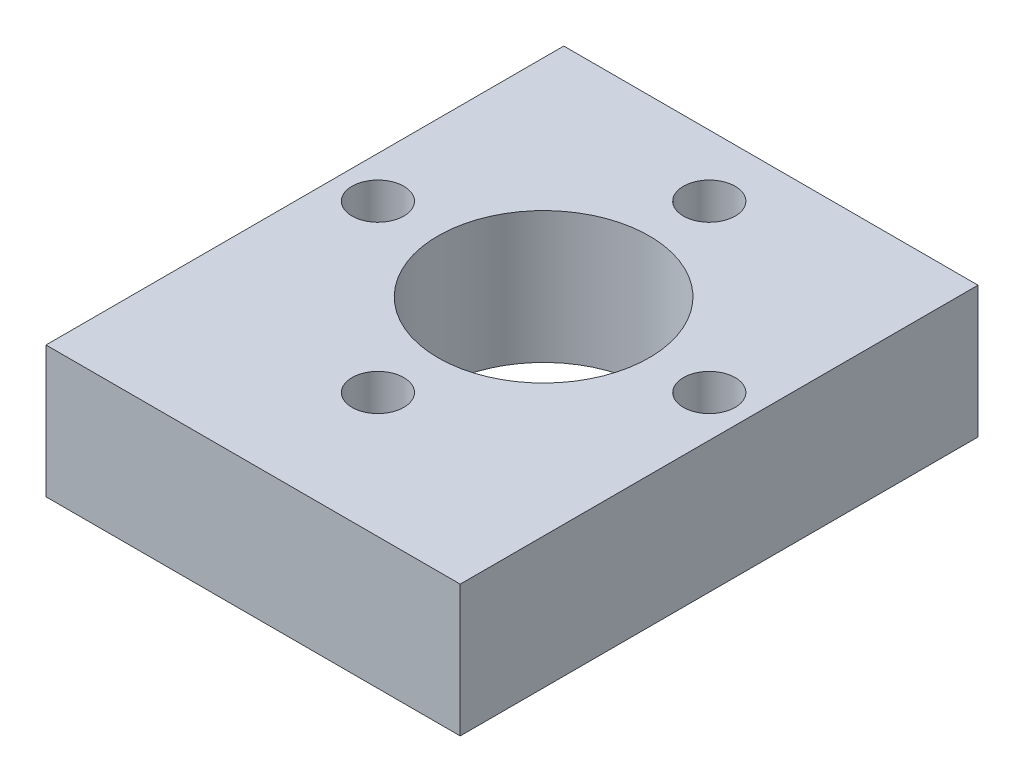
ISO-10303-21;
HEADER;
FILE_DESCRIPTION(('STEP AP214'),'2;1');
FILE_NAME('part.step','',(''),(''),'','','');
FILE_SCHEMA(('AUTOMOTIVE_DESIGN { 1 0 10303 214 1 1 1 1 }'));
ENDSEC;
DATA;
#1=APPLICATION_CONTEXT('core data for automotive mechanical design processes');
#2=APPLICATION_PROTOCOL_DEFINITION('international standard','automotive_design',2000,#1);
#3=PRODUCT_CONTEXT('',#1,'mechanical');
#4=PRODUCT('Part','Part','',(#3));
#5=PRODUCT_RELATED_PRODUCT_CATEGORY('part','',(#4));
#6=PRODUCT_DEFINITION_FORMATION('','',#4);
#7=PRODUCT_DEFINITION_CONTEXT('part definition',#1,'design');
#8=PRODUCT_DEFINITION('design','',#6,#7);
#9=PRODUCT_DEFINITION_SHAPE('','',#8);
#10=(LENGTH_UNIT() NAMED_UNIT(*) SI_UNIT(.MILLI.,.METRE.));
#11=(NAMED_UNIT(*) PLANE_ANGLE_UNIT() SI_UNIT($,.RADIAN.));
#12=(NAMED_UNIT(*) SI_UNIT($,.STERADIAN.) SOLID_ANGLE_UNIT());
#13=UNCERTAINTY_MEASURE_WITH_UNIT(LENGTH_MEASURE(1.E-05),#10,'distance_accuracy_value','');
#14=(GEOMETRIC_REPRESENTATION_CONTEXT(3) GLOBAL_UNCERTAINTY_ASSIGNED_CONTEXT((#13)) GLOBAL_UNIT_ASSIGNED_CONTEXT((#10,
#11,#12)) REPRESENTATION_CONTEXT('',''));
#15=CARTESIAN_POINT('',(0.,0.,0.));
#16=DIRECTION('',(0.,0.,1.));
#17=DIRECTION('',(1.,0.,0.));
#18=AXIS2_PLACEMENT_3D('',#15,#16,#17);
#19=CARTESIAN_POINT('',(0.,6.35,12.5));
#20=DIRECTION('',(0.,0.,-1.));
#21=DIRECTION('',(-1.,0.,0.));
#22=AXIS2_PLACEMENT_3D('',#19,#20,#21);
#23=PLANE('',#22);
#24=DIRECTION('',(1.,0.,0.));
#25=VECTOR('',#24,1.);
#26=CARTESIAN_POINT('',(0.,0.,12.5));
#27=LINE('',#26,#25);
#28=CARTESIAN_POINT('',(-10.,0.,12.5));
#29=VERTEX_POINT('',#28);
#30=CARTESIAN_POINT('',(10.,0.,12.5));
#31=VERTEX_POINT('',#30);
#32=EDGE_CURVE('E177',#29,#31,#27,.T.);
#33=ORIENTED_EDGE('',*,*,#32,.T.);
#34=DIRECTION('',(0.,-1.,0.));
#35=VECTOR('',#34,1.);
#36=CARTESIAN_POINT('',(10.,6.35,12.5));
#37=LINE('',#36,#35);
#38=CARTESIAN_POINT('',(10.,6.35,12.5));
#39=VERTEX_POINT('',#38);
#40=EDGE_CURVE('E11',#39,#31,#37,.T.);
#41=ORIENTED_EDGE('',*,*,#40,.F.);
#42=DIRECTION('',(1.,0.,0.));
#43=VECTOR('',#42,1.);
#44=CARTESIAN_POINT('',(0.,6.35,12.5));
#45=LINE('',#44,#43);
#46=CARTESIAN_POINT('',(-10.,6.35,12.5));
#47=VERTEX_POINT('',#46);
#48=EDGE_CURVE('E161',#47,#39,#45,.T.);
#49=ORIENTED_EDGE('',*,*,#48,.F.);
#50=DIRECTION('',(0.,-1.,0.));
#51=VECTOR('',#50,1.);
#52=CARTESIAN_POINT('',(-10.,6.35,12.5));
#53=LINE('',#52,#51);
#54=EDGE_CURVE('E65',#47,#29,#53,.T.);
#55=ORIENTED_EDGE('',*,*,#54,.T.);
#56=EDGE_LOOP('',(#33,#41,#49,#55));
#57=FACE_BOUND('',#56,.T.);
#58=ADVANCED_FACE('F47',(#57),#23,.F.);
#59=CARTESIAN_POINT('',(10.,6.35,0.));
#60=DIRECTION('',(-1.,0.,0.));
#61=DIRECTION('',(0.,0.,1.));
#62=AXIS2_PLACEMENT_3D('',#59,#60,#61);
#63=PLANE('',#62);
#64=DIRECTION('',(0.,0.,-1.));
#65=VECTOR('',#64,1.);
#66=CARTESIAN_POINT('',(10.,0.,0.));
#67=LINE('',#66,#65);
#68=CARTESIAN_POINT('',(10.,0.,-12.5));
#69=VERTEX_POINT('',#68);
#70=EDGE_CURVE('E180',#31,#69,#67,.T.);
#71=ORIENTED_EDGE('',*,*,#70,.T.);
#72=DIRECTION('',(0.,-1.,0.));
#73=VECTOR('',#72,1.);
#74=CARTESIAN_POINT('',(10.,6.35,-12.5));
#75=LINE('',#74,#73);
#76=CARTESIAN_POINT('',(10.,6.35,-12.5));
#77=VERTEX_POINT('',#76);
#78=EDGE_CURVE('E57',#77,#69,#75,.T.);
#79=ORIENTED_EDGE('',*,*,#78,.F.);
#80=DIRECTION('',(0.,0.,-1.));
#81=VECTOR('',#80,1.);
#82=CARTESIAN_POINT('',(10.,6.35,0.));
#83=LINE('',#82,#81);
#84=EDGE_CURVE('E91',#39,#77,#83,.T.);
#85=ORIENTED_EDGE('',*,*,#84,.F.);
#86=ORIENTED_EDGE('',*,*,#40,.T.);
#87=EDGE_LOOP('',(#71,#79,#85,#86));
#88=FACE_BOUND('',#87,.T.);
#89=ADVANCED_FACE('F198',(#88),#63,.F.);
#90=CARTESIAN_POINT('',(0.,6.35,-12.5));
#91=DIRECTION('',(0.,0.,-1.));
#92=DIRECTION('',(-1.,0.,0.));
#93=AXIS2_PLACEMENT_3D('',#90,#91,#92);
#94=PLANE('',#93);
#95=CARTESIAN_POINT('',(7.,3.175,-12.5));
#96=DIRECTION('',(0.,0.,-1.));
#97=DIRECTION('',(-1.,0.,0.));
#98=AXIS2_PLACEMENT_3D('',#95,#96,#97);
#99=CIRCLE('',#98,1.24999999999999);
#100=CARTESIAN_POINT('',(5.75000000000001,3.175,-12.5));
#101=VERTEX_POINT('',#100);
#102=EDGE_CURVE('E111',#101,#101,#99,.T.);
#103=ORIENTED_EDGE('',*,*,#102,.F.);
#104=EDGE_LOOP('',(#103));
#105=FACE_BOUND('',#104,.T.);
#106=CARTESIAN_POINT('',(-7.,3.175,-12.5));
#107=DIRECTION('',(0.,0.,-1.));
#108=DIRECTION('',(-1.,0.,0.));
#109=AXIS2_PLACEMENT_3D('',#106,#107,#108);
#110=CIRCLE('',#109,1.24999999999999);
#111=CARTESIAN_POINT('',(-8.24999999999999,3.175,-12.5));
#112=VERTEX_POINT('',#111);
#113=EDGE_CURVE('E110',#112,#112,#110,.T.);
#114=ORIENTED_EDGE('',*,*,#113,.F.);
#115=EDGE_LOOP('',(#114));
#116=FACE_BOUND('',#115,.T.);
#117=DIRECTION('',(1.,0.,0.));
#118=VECTOR('',#117,1.);
#119=CARTESIAN_POINT('',(0.,0.,-12.5));
#120=LINE('',#119,#118);
#121=CARTESIAN_POINT('',(-10.,0.,-12.5));
#122=VERTEX_POINT('',#121);
#123=EDGE_CURVE('E184',#122,#69,#120,.T.);
#124=ORIENTED_EDGE('',*,*,#123,.F.);
#125=DIRECTION('',(0.,-1.,0.));
#126=VECTOR('',#125,1.);
#127=CARTESIAN_POINT('',(-10.,6.35,-12.5));
#128=LINE('',#127,#126);
#129=CARTESIAN_POINT('',(-10.,6.35,-12.5));
#130=VERTEX_POINT('',#129);
#131=EDGE_CURVE('E80',#130,#122,#128,.T.);
#132=ORIENTED_EDGE('',*,*,#131,.F.);
#133=DIRECTION('',(1.,0.,0.));
#134=VECTOR('',#133,1.);
#135=CARTESIAN_POINT('',(0.,6.35,-12.5));
#136=LINE('',#135,#134);
#137=EDGE_CURVE('E167',#130,#77,#136,.T.);
#138=ORIENTED_EDGE('',*,*,#137,.T.);
#139=ORIENTED_EDGE('',*,*,#78,.T.);
#140=EDGE_LOOP('',(#124,#132,#138,#139));
#141=FACE_BOUND('',#140,.T.);
#142=ADVANCED_FACE('F196',(#105,#116,#141),#94,.T.);
#143=CARTESIAN_POINT('',(0.,6.35,-1.5261946));
#144=DIRECTION('',(0.,-1.,0.));
#145=DIRECTION('',(0.,0.,-1.));
#146=AXIS2_PLACEMENT_3D('',#143,#144,#145);
#147=CYLINDRICAL_SURFACE('',#146,5.1);
#148=CARTESIAN_POINT('',(0.,6.35,-1.5261946));
#149=DIRECTION('',(0.,1.,0.));
#150=DIRECTION('',(0.,0.,1.));
#151=AXIS2_PLACEMENT_3D('',#148,#149,#150);
#152=CIRCLE('',#151,5.1);
#153=CARTESIAN_POINT('',(0.,6.35,3.5738054));
#154=VERTEX_POINT('',#153);
#155=EDGE_CURVE('E157',#154,#154,#152,.T.);
#156=ORIENTED_EDGE('',*,*,#155,.T.);
#157=EDGE_LOOP('',(#156));
#158=FACE_BOUND('',#157,.T.);
#159=CARTESIAN_POINT('',(0.,0.,-1.5261946));
#160=DIRECTION('',(0.,1.,0.));
#161=DIRECTION('',(0.,0.,1.));
#162=AXIS2_PLACEMENT_3D('',#159,#160,#161);
#163=CIRCLE('',#162,5.1);
#164=CARTESIAN_POINT('',(0.,0.,3.5738054));
#165=VERTEX_POINT('',#164);
#166=EDGE_CURVE('E156',#165,#165,#163,.T.);
#167=ORIENTED_EDGE('',*,*,#166,.F.);
#168=EDGE_LOOP('',(#167));
#169=FACE_BOUND('',#168,.T.);
#170=ADVANCED_FACE('F49',(#158,#169),#147,.F.);
#171=CARTESIAN_POINT('',(-10.,6.35,0.));
#172=DIRECTION('',(-1.,0.,0.));
#173=DIRECTION('',(0.,0.,1.));
#174=AXIS2_PLACEMENT_3D('',#171,#172,#173);
#175=PLANE('',#174);
#176=DIRECTION('',(0.,0.,-1.));
#177=VECTOR('',#176,1.);
#178=CARTESIAN_POINT('',(-10.,0.,0.));
#179=LINE('',#178,#177);
#180=EDGE_CURVE('E162',#29,#122,#179,.T.);
#181=ORIENTED_EDGE('',*,*,#180,.F.);
#182=ORIENTED_EDGE('',*,*,#54,.F.);
#183=DIRECTION('',(0.,0.,-1.));
#184=VECTOR('',#183,1.);
#185=CARTESIAN_POINT('',(-10.,6.35,0.));
#186=LINE('',#185,#184);
#187=EDGE_CURVE('E171',#47,#130,#186,.T.);
#188=ORIENTED_EDGE('',*,*,#187,.T.);
#189=ORIENTED_EDGE('',*,*,#131,.T.);
#190=EDGE_LOOP('',(#181,#182,#188,#189));
#191=FACE_BOUND('',#190,.T.);
#192=ADVANCED_FACE('F202',(#191),#175,.T.);
#193=CARTESIAN_POINT('',(0.,6.35,0.));
#194=DIRECTION('',(0.,1.,0.));
#195=DIRECTION('',(0.,0.,1.));
#196=AXIS2_PLACEMENT_3D('',#193,#194,#195);
#197=PLANE('',#196);
#198=CARTESIAN_POINT('',(0.,6.35,-9.5261946));
#199=DIRECTION('',(0.,1.,0.));
#200=DIRECTION('',(0.,0.,1.));
#201=AXIS2_PLACEMENT_3D('',#198,#199,#200);
#202=CIRCLE('',#201,1.25);
#203=CARTESIAN_POINT('',(0.,6.35,-8.2761946));
#204=VERTEX_POINT('',#203);
#205=EDGE_CURVE('E124',#204,#204,#202,.T.);
#206=ORIENTED_EDGE('',*,*,#205,.F.);
#207=EDGE_LOOP('',(#206));
#208=FACE_BOUND('',#207,.T.);
#209=CARTESIAN_POINT('',(8.,6.35,-1.5261946));
#210=DIRECTION('',(0.,1.,0.));
#211=DIRECTION('',(0.,0.,1.));
#212=AXIS2_PLACEMENT_3D('',#209,#210,#211);
#213=CIRCLE('',#212,1.25);
#214=CARTESIAN_POINT('',(8.,6.35,-0.276194600000001));
#215=VERTEX_POINT('',#214);
#216=EDGE_CURVE('E132',#215,#215,#213,.T.);
#217=ORIENTED_EDGE('',*,*,#216,.F.);
#218=EDGE_LOOP('',(#217));
#219=FACE_BOUND('',#218,.T.);
#220=CARTESIAN_POINT('',(0.,6.35,6.4738054));
#221=DIRECTION('',(0.,1.,0.));
#222=DIRECTION('',(0.,0.,1.));
#223=AXIS2_PLACEMENT_3D('',#220,#221,#222);
#224=CIRCLE('',#223,1.25);
#225=CARTESIAN_POINT('',(0.,6.35,7.7238054));
#226=VERTEX_POINT('',#225);
#227=EDGE_CURVE('E140',#226,#226,#224,.T.);
#228=ORIENTED_EDGE('',*,*,#227,.F.);
#229=EDGE_LOOP('',(#228));
#230=FACE_BOUND('',#229,.T.);
#231=CARTESIAN_POINT('',(-8.,6.35,-1.5261946));
#232=DIRECTION('',(0.,1.,0.));
#233=DIRECTION('',(0.,0.,1.));
#234=AXIS2_PLACEMENT_3D('',#231,#232,#233);
#235=CIRCLE('',#234,1.25);
#236=CARTESIAN_POINT('',(-8.,6.35,-0.276194600000001));
#237=VERTEX_POINT('',#236);
#238=EDGE_CURVE('E148',#237,#237,#235,.T.);
#239=ORIENTED_EDGE('',*,*,#238,.F.);
#240=EDGE_LOOP('',(#239));
#241=FACE_BOUND('',#240,.T.);
#242=ORIENTED_EDGE('',*,*,#155,.F.);
#243=EDGE_LOOP('',(#242));
#244=FACE_BOUND('',#243,.T.);
#245=ORIENTED_EDGE('',*,*,#48,.T.);
#246=ORIENTED_EDGE('',*,*,#84,.T.);
#247=ORIENTED_EDGE('',*,*,#137,.F.);
#248=ORIENTED_EDGE('',*,*,#187,.F.);
#249=EDGE_LOOP('',(#245,#246,#247,#248));
#250=FACE_BOUND('',#249,.T.);
#251=ADVANCED_FACE('F204',(#208,#219,#230,#241,#244,#250),#197,.T.);
#252=CARTESIAN_POINT('',(0.,0.,0.));
#253=DIRECTION('',(0.,1.,0.));
#254=DIRECTION('',(0.,0.,1.));
#255=AXIS2_PLACEMENT_3D('',#252,#253,#254);
#256=PLANE('',#255);
#257=CARTESIAN_POINT('',(0.,0.,-9.5261946));
#258=DIRECTION('',(0.,1.,0.));
#259=DIRECTION('',(0.,0.,1.));
#260=AXIS2_PLACEMENT_3D('',#257,#258,#259);
#261=CIRCLE('',#260,1.25);
#262=CARTESIAN_POINT('',(0.,0.,-8.2761946));
#263=VERTEX_POINT('',#262);
#264=EDGE_CURVE('E128',#263,#263,#261,.T.);
#265=ORIENTED_EDGE('',*,*,#264,.T.);
#266=EDGE_LOOP('',(#265));
#267=FACE_BOUND('',#266,.T.);
#268=CARTESIAN_POINT('',(8.,0.,-1.5261946));
#269=DIRECTION('',(0.,1.,0.));
#270=DIRECTION('',(0.,0.,1.));
#271=AXIS2_PLACEMENT_3D('',#268,#269,#270);
#272=CIRCLE('',#271,1.25);
#273=CARTESIAN_POINT('',(8.,0.,-0.276194600000002));
#274=VERTEX_POINT('',#273);
#275=EDGE_CURVE('E136',#274,#274,#272,.T.);
#276=ORIENTED_EDGE('',*,*,#275,.T.);
#277=EDGE_LOOP('',(#276));
#278=FACE_BOUND('',#277,.T.);
#279=CARTESIAN_POINT('',(0.,0.,6.4738054));
#280=DIRECTION('',(0.,1.,0.));
#281=DIRECTION('',(0.,0.,1.));
#282=AXIS2_PLACEMENT_3D('',#279,#280,#281);
#283=CIRCLE('',#282,1.25);
#284=CARTESIAN_POINT('',(0.,0.,7.7238054));
#285=VERTEX_POINT('',#284);
#286=EDGE_CURVE('E144',#285,#285,#283,.T.);
#287=ORIENTED_EDGE('',*,*,#286,.T.);
#288=EDGE_LOOP('',(#287));
#289=FACE_BOUND('',#288,.T.);
#290=CARTESIAN_POINT('',(-8.,0.,-1.5261946));
#291=DIRECTION('',(0.,1.,0.));
#292=DIRECTION('',(0.,0.,1.));
#293=AXIS2_PLACEMENT_3D('',#290,#291,#292);
#294=CIRCLE('',#293,1.25);
#295=CARTESIAN_POINT('',(-8.,0.,-0.276194600000002));
#296=VERTEX_POINT('',#295);
#297=EDGE_CURVE('E152',#296,#296,#294,.T.);
#298=ORIENTED_EDGE('',*,*,#297,.T.);
#299=EDGE_LOOP('',(#298));
#300=FACE_BOUND('',#299,.T.);
#301=ORIENTED_EDGE('',*,*,#166,.T.);
#302=EDGE_LOOP('',(#301));
#303=FACE_BOUND('',#302,.T.);
#304=ORIENTED_EDGE('',*,*,#32,.F.);
#305=ORIENTED_EDGE('',*,*,#180,.T.);
#306=ORIENTED_EDGE('',*,*,#123,.T.);
#307=ORIENTED_EDGE('',*,*,#70,.F.);
#308=EDGE_LOOP('',(#304,#305,#306,#307));
#309=FACE_BOUND('',#308,.T.);
#310=ADVANCED_FACE('F201',(#267,#278,#289,#300,#303,#309),#256,.F.);
#311=CARTESIAN_POINT('',(-8.,6.35,-1.5261946));
#312=DIRECTION('',(0.,1.,0.));
#313=DIRECTION('',(0.,0.,1.));
#314=AXIS2_PLACEMENT_3D('',#311,#312,#313);
#315=CYLINDRICAL_SURFACE('',#314,1.25);
#316=ORIENTED_EDGE('',*,*,#297,.F.);
#317=EDGE_LOOP('',(#316));
#318=FACE_BOUND('',#317,.T.);
#319=ORIENTED_EDGE('',*,*,#238,.T.);
#320=EDGE_LOOP('',(#319));
#321=FACE_BOUND('',#320,.T.);
#322=ADVANCED_FACE('F251',(#318,#321),#315,.F.);
#323=CARTESIAN_POINT('',(0.,6.35,6.4738054));
#324=DIRECTION('',(0.,1.,0.));
#325=DIRECTION('',(0.,0.,1.));
#326=AXIS2_PLACEMENT_3D('',#323,#324,#325);
#327=CYLINDRICAL_SURFACE('',#326,1.25);
#328=ORIENTED_EDGE('',*,*,#286,.F.);
#329=EDGE_LOOP('',(#328));
#330=FACE_BOUND('',#329,.T.);
#331=ORIENTED_EDGE('',*,*,#227,.T.);
#332=EDGE_LOOP('',(#331));
#333=FACE_BOUND('',#332,.T.);
#334=ADVANCED_FACE('F247',(#330,#333),#327,.F.);
#335=CARTESIAN_POINT('',(8.,6.35,-1.5261946));
#336=DIRECTION('',(0.,1.,0.));
#337=DIRECTION('',(0.,0.,1.));
#338=AXIS2_PLACEMENT_3D('',#335,#336,#337);
#339=CYLINDRICAL_SURFACE('',#338,1.25);
#340=ORIENTED_EDGE('',*,*,#275,.F.);
#341=EDGE_LOOP('',(#340));
#342=FACE_BOUND('',#341,.T.);
#343=ORIENTED_EDGE('',*,*,#216,.T.);
#344=EDGE_LOOP('',(#343));
#345=FACE_BOUND('',#344,.T.);
#346=ADVANCED_FACE('F243',(#342,#345),#339,.F.);
#347=CARTESIAN_POINT('',(0.,6.35,-9.5261946));
#348=DIRECTION('',(0.,1.,0.));
#349=DIRECTION('',(0.,0.,1.));
#350=AXIS2_PLACEMENT_3D('',#347,#348,#349);
#351=CYLINDRICAL_SURFACE('',#350,1.25);
#352=ORIENTED_EDGE('',*,*,#264,.F.);
#353=EDGE_LOOP('',(#352));
#354=FACE_BOUND('',#353,.T.);
#355=ORIENTED_EDGE('',*,*,#205,.T.);
#356=EDGE_LOOP('',(#355));
#357=FACE_BOUND('',#356,.T.);
#358=ADVANCED_FACE('F236',(#354,#357),#351,.F.);
#359=CARTESIAN_POINT('',(-7.,3.175,-6.5));
#360=DIRECTION('',(0.,0.,-1.));
#361=DIRECTION('',(-1.,0.,0.));
#362=AXIS2_PLACEMENT_3D('',#359,#360,#361);
#363=CONICAL_SURFACE('',#362,1.25,1.02974425867665);
#364=CARTESIAN_POINT('',(-7.,3.175,-5.74892422621555));
#365=VERTEX_POINT('',#364);
#366=VERTEX_LOOP('',#365);
#367=FACE_BOUND('',#366,.T.);
#368=CARTESIAN_POINT('',(-7.,3.175,-6.5));
#369=DIRECTION('',(0.,0.,-1.));
#370=DIRECTION('',(-1.,0.,0.));
#371=AXIS2_PLACEMENT_3D('',#368,#369,#370);
#372=CIRCLE('',#371,1.25);
#373=CARTESIAN_POINT('',(-8.25,3.175,-6.5));
#374=VERTEX_POINT('',#373);
#375=EDGE_CURVE('E116',#374,#374,#372,.T.);
#376=ORIENTED_EDGE('',*,*,#375,.T.);
#377=EDGE_LOOP('',(#376));
#378=FACE_BOUND('',#377,.T.);
#379=ADVANCED_FACE('F231',(#367,#378),#363,.F.);
#380=CARTESIAN_POINT('',(-7.,3.175,-12.5));
#381=DIRECTION('',(0.,0.,-1.));
#382=DIRECTION('',(-1.,0.,0.));
#383=AXIS2_PLACEMENT_3D('',#380,#381,#382);
#384=CYLINDRICAL_SURFACE('',#383,1.24999999999999);
#385=ORIENTED_EDGE('',*,*,#375,.F.);
#386=EDGE_LOOP('',(#385));
#387=FACE_BOUND('',#386,.T.);
#388=ORIENTED_EDGE('',*,*,#113,.T.);
#389=EDGE_LOOP('',(#388));
#390=FACE_BOUND('',#389,.T.);
#391=ADVANCED_FACE('F103',(#387,#390),#384,.F.);
#392=CARTESIAN_POINT('',(7.,3.175,-6.5));
#393=DIRECTION('',(0.,0.,-1.));
#394=DIRECTION('',(-1.,0.,0.));
#395=AXIS2_PLACEMENT_3D('',#392,#393,#394);
#396=CONICAL_SURFACE('',#395,1.25,1.02974425867665);
#397=CARTESIAN_POINT('',(7.,3.175,-5.74892422621555));
#398=VERTEX_POINT('',#397);
#399=VERTEX_LOOP('',#398);
#400=FACE_BOUND('',#399,.T.);
#401=CARTESIAN_POINT('',(7.,3.175,-6.5));
#402=DIRECTION('',(0.,0.,-1.));
#403=DIRECTION('',(-1.,0.,0.));
#404=AXIS2_PLACEMENT_3D('',#401,#402,#403);
#405=CIRCLE('',#404,1.25);
#406=CARTESIAN_POINT('',(5.75,3.175,-6.5));
#407=VERTEX_POINT('',#406);
#408=EDGE_CURVE('E107',#407,#407,#405,.T.);
#409=ORIENTED_EDGE('',*,*,#408,.T.);
#410=EDGE_LOOP('',(#409));
#411=FACE_BOUND('',#410,.T.);
#412=ADVANCED_FACE('F99',(#400,#411),#396,.F.);
#413=CARTESIAN_POINT('',(7.,3.175,-12.5));
#414=DIRECTION('',(0.,0.,-1.));
#415=DIRECTION('',(-1.,0.,0.));
#416=AXIS2_PLACEMENT_3D('',#413,#414,#415);
#417=CYLINDRICAL_SURFACE('',#416,1.24999999999999);
#418=ORIENTED_EDGE('',*,*,#408,.F.);
#419=EDGE_LOOP('',(#418));
#420=FACE_BOUND('',#419,.T.);
#421=ORIENTED_EDGE('',*,*,#102,.T.);
#422=EDGE_LOOP('',(#421));
#423=FACE_BOUND('',#422,.T.);
#424=ADVANCED_FACE('F102',(#420,#423),#417,.F.);
#425=CLOSED_SHELL('',(#58,#89,#142,#170,#192,#251,#310,#322,#334,#346,#358,#379,#391,#412,#424));
#426=MANIFOLD_SOLID_BREP('B2',#425);
#427=ADVANCED_BREP_SHAPE_REPRESENTATION('',(#18,#426),#14);
#428=SHAPE_DEFINITION_REPRESENTATION(#9,#427);
ENDSEC;
END-ISO-10303-21;
